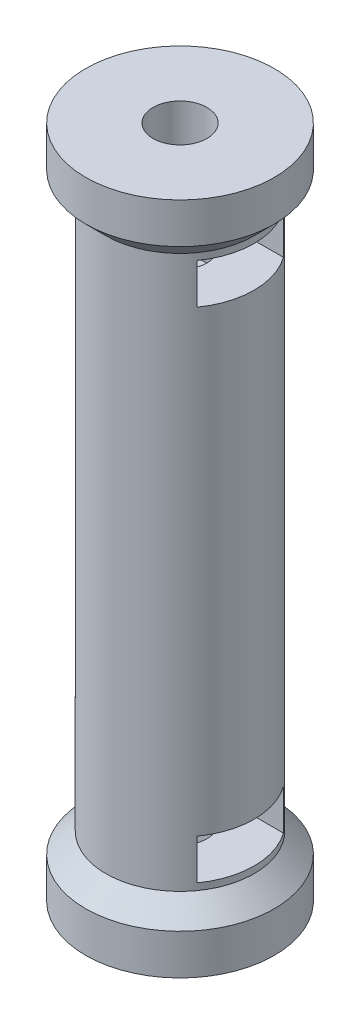
ISO-10303-21;
HEADER;
FILE_DESCRIPTION(('STEP AP214'),'2;1');
FILE_NAME('part.step','',(''),(''),'','','');
FILE_SCHEMA(('AUTOMOTIVE_DESIGN { 1 0 10303 214 1 1 1 1 }'));
ENDSEC;
DATA;
#1=APPLICATION_CONTEXT('core data for automotive mechanical design processes');
#2=APPLICATION_PROTOCOL_DEFINITION('international standard','automotive_design',2000,#1);
#3=PRODUCT_CONTEXT('',#1,'mechanical');
#4=PRODUCT('Part','Part','',(#3));
#5=PRODUCT_RELATED_PRODUCT_CATEGORY('part','',(#4));
#6=PRODUCT_DEFINITION_FORMATION('','',#4);
#7=PRODUCT_DEFINITION_CONTEXT('part definition',#1,'design');
#8=PRODUCT_DEFINITION('design','',#6,#7);
#9=PRODUCT_DEFINITION_SHAPE('','',#8);
#10=(LENGTH_UNIT() NAMED_UNIT(*) SI_UNIT(.MILLI.,.METRE.));
#11=(NAMED_UNIT(*) PLANE_ANGLE_UNIT() SI_UNIT($,.RADIAN.));
#12=(NAMED_UNIT(*) SI_UNIT($,.STERADIAN.) SOLID_ANGLE_UNIT());
#13=UNCERTAINTY_MEASURE_WITH_UNIT(LENGTH_MEASURE(1.E-05),#10,'distance_accuracy_value','');
#14=(GEOMETRIC_REPRESENTATION_CONTEXT(3) GLOBAL_UNCERTAINTY_ASSIGNED_CONTEXT((#13)) GLOBAL_UNIT_ASSIGNED_CONTEXT((#10,
#11,#12)) REPRESENTATION_CONTEXT('',''));
#15=CARTESIAN_POINT('',(0.,0.,0.));
#16=DIRECTION('',(0.,0.,1.));
#17=DIRECTION('',(1.,0.,0.));
#18=AXIS2_PLACEMENT_3D('',#15,#16,#17);
#19=CARTESIAN_POINT('',(0.,20.,0.));
#20=DIRECTION('',(0.,-1.,0.));
#21=DIRECTION('',(0.,0.,-1.));
#22=AXIS2_PLACEMENT_3D('',#19,#20,#21);
#23=CYLINDRICAL_SURFACE('',#22,5.5);
#24=CARTESIAN_POINT('',(0.,17.,0.));
#25=DIRECTION('',(0.,1.,0.));
#26=DIRECTION('',(0.,0.,1.));
#27=AXIS2_PLACEMENT_3D('',#24,#25,#26);
#28=CIRCLE('',#27,5.5);
#29=CARTESIAN_POINT('',(4.47325384926901,17.,3.2));
#30=VERTEX_POINT('',#29);
#31=CARTESIAN_POINT('',(4.47325384926901,17.,-3.2));
#32=VERTEX_POINT('',#31);
#33=EDGE_CURVE('E221',#30,#32,#28,.T.);
#34=ORIENTED_EDGE('',*,*,#33,.F.);
#35=DIRECTION('',(0.,-1.,0.));
#36=VECTOR('',#35,1.);
#37=CARTESIAN_POINT('',(4.47325384926901,20.,3.2));
#38=LINE('',#37,#36);
#39=CARTESIAN_POINT('',(4.47325384926901,20.,3.2));
#40=VERTEX_POINT('',#39);
#41=EDGE_CURVE('E239',#40,#30,#38,.T.);
#42=ORIENTED_EDGE('',*,*,#41,.F.);
#43=CARTESIAN_POINT('',(0.,20.,0.));
#44=DIRECTION('',(0.,1.,0.));
#45=DIRECTION('',(0.,0.,1.));
#46=AXIS2_PLACEMENT_3D('',#43,#44,#45);
#47=CIRCLE('',#46,5.5);
#48=CARTESIAN_POINT('',(4.47325384926901,20.,-3.2));
#49=VERTEX_POINT('',#48);
#50=EDGE_CURVE('E217',#40,#49,#47,.T.);
#51=ORIENTED_EDGE('',*,*,#50,.T.);
#52=DIRECTION('',(0.,-1.,0.));
#53=VECTOR('',#52,1.);
#54=CARTESIAN_POINT('',(4.47325384926901,20.,-3.2));
#55=LINE('',#54,#53);
#56=EDGE_CURVE('E245',#32,#49,#55,.F.);
#57=ORIENTED_EDGE('',*,*,#56,.F.);
#58=EDGE_LOOP('',(#34,#42,#51,#57));
#59=FACE_BOUND('',#58,.T.);
#60=CARTESIAN_POINT('',(0.,20.5,0.));
#61=DIRECTION('',(0.,1.,0.));
#62=DIRECTION('',(0.,0.,1.));
#63=AXIS2_PLACEMENT_3D('',#60,#61,#62);
#64=CIRCLE('',#63,5.5);
#65=CARTESIAN_POINT('',(0.,20.5,5.5));
#66=VERTEX_POINT('',#65);
#67=EDGE_CURVE('E236',#66,#66,#64,.F.);
#68=ORIENTED_EDGE('',*,*,#67,.T.);
#69=EDGE_LOOP('',(#68));
#70=FACE_BOUND('',#69,.T.);
#71=CARTESIAN_POINT('',(0.,-20.5,0.));
#72=DIRECTION('',(0.,-1.,0.));
#73=DIRECTION('',(0.,0.,-1.));
#74=AXIS2_PLACEMENT_3D('',#71,#72,#73);
#75=CIRCLE('',#74,5.5);
#76=CARTESIAN_POINT('',(0.,-20.5,-5.5));
#77=VERTEX_POINT('',#76);
#78=EDGE_CURVE('E153',#77,#77,#75,.F.);
#79=ORIENTED_EDGE('',*,*,#78,.T.);
#80=EDGE_LOOP('',(#79));
#81=FACE_BOUND('',#80,.T.);
#82=CARTESIAN_POINT('',(0.,-17.,0.));
#83=DIRECTION('',(0.,-1.,0.));
#84=DIRECTION('',(0.,0.,-1.));
#85=AXIS2_PLACEMENT_3D('',#82,#83,#84);
#86=CIRCLE('',#85,5.5);
#87=CARTESIAN_POINT('',(4.47325384926901,-17.,-3.2));
#88=VERTEX_POINT('',#87);
#89=CARTESIAN_POINT('',(4.47325384926901,-17.,3.2));
#90=VERTEX_POINT('',#89);
#91=EDGE_CURVE('E151',#88,#90,#86,.T.);
#92=ORIENTED_EDGE('',*,*,#91,.F.);
#93=DIRECTION('',(0.,-1.,0.));
#94=VECTOR('',#93,1.);
#95=CARTESIAN_POINT('',(4.47325384926901,20.,-3.2));
#96=LINE('',#95,#94);
#97=CARTESIAN_POINT('',(4.47325384926901,-20.,-3.2));
#98=VERTEX_POINT('',#97);
#99=EDGE_CURVE('E134',#88,#98,#96,.T.);
#100=ORIENTED_EDGE('',*,*,#99,.T.);
#101=CARTESIAN_POINT('',(0.,-20.,0.));
#102=DIRECTION('',(0.,-1.,0.));
#103=DIRECTION('',(0.,0.,-1.));
#104=AXIS2_PLACEMENT_3D('',#101,#102,#103);
#105=CIRCLE('',#104,5.5);
#106=CARTESIAN_POINT('',(4.47325384926901,-20.,3.2));
#107=VERTEX_POINT('',#106);
#108=EDGE_CURVE('E142',#98,#107,#105,.T.);
#109=ORIENTED_EDGE('',*,*,#108,.T.);
#110=DIRECTION('',(0.,-1.,0.));
#111=VECTOR('',#110,1.);
#112=CARTESIAN_POINT('',(4.47325384926901,20.,3.2));
#113=LINE('',#112,#111);
#114=EDGE_CURVE('E152',#107,#90,#113,.F.);
#115=ORIENTED_EDGE('',*,*,#114,.T.);
#116=EDGE_LOOP('',(#92,#100,#109,#115));
#117=FACE_BOUND('',#116,.T.);
#118=ADVANCED_FACE('F37',(#59,#70,#81,#117),#23,.T.);
#119=CARTESIAN_POINT('',(0.,25.,0.));
#120=DIRECTION('',(0.,-1.,0.));
#121=DIRECTION('',(0.,0.,-1.));
#122=AXIS2_PLACEMENT_3D('',#119,#120,#121);
#123=CYLINDRICAL_SURFACE('',#122,7.);
#124=CARTESIAN_POINT('',(0.,22.,0.));
#125=DIRECTION('',(0.,1.,0.));
#126=DIRECTION('',(0.,0.,1.));
#127=AXIS2_PLACEMENT_3D('',#124,#125,#126);
#128=CIRCLE('',#127,7.);
#129=CARTESIAN_POINT('',(0.,22.,7.));
#130=VERTEX_POINT('',#129);
#131=EDGE_CURVE('E233',#130,#130,#128,.T.);
#132=ORIENTED_EDGE('',*,*,#131,.T.);
#133=EDGE_LOOP('',(#132));
#134=FACE_BOUND('',#133,.T.);
#135=CARTESIAN_POINT('',(0.,25.,0.));
#136=DIRECTION('',(0.,1.,0.));
#137=DIRECTION('',(0.,0.,1.));
#138=AXIS2_PLACEMENT_3D('',#135,#136,#137);
#139=CIRCLE('',#138,7.);
#140=CARTESIAN_POINT('',(0.,25.,7.));
#141=VERTEX_POINT('',#140);
#142=EDGE_CURVE('E228',#141,#141,#139,.T.);
#143=ORIENTED_EDGE('',*,*,#142,.F.);
#144=EDGE_LOOP('',(#143));
#145=FACE_BOUND('',#144,.T.);
#146=ADVANCED_FACE('F279',(#134,#145),#123,.T.);
#147=CARTESIAN_POINT('',(0.,25.,0.));
#148=DIRECTION('',(0.,1.,0.));
#149=DIRECTION('',(0.,0.,1.));
#150=AXIS2_PLACEMENT_3D('',#147,#148,#149);
#151=PLANE('',#150);
#152=CARTESIAN_POINT('',(0.,25.,0.));
#153=DIRECTION('',(0.,1.,0.));
#154=DIRECTION('',(0.,0.,1.));
#155=AXIS2_PLACEMENT_3D('',#152,#153,#154);
#156=CIRCLE('',#155,2.);
#157=CARTESIAN_POINT('',(0.,25.,2.));
#158=VERTEX_POINT('',#157);
#159=EDGE_CURVE('E224',#158,#158,#156,.T.);
#160=ORIENTED_EDGE('',*,*,#159,.F.);
#161=EDGE_LOOP('',(#160));
#162=FACE_BOUND('',#161,.T.);
#163=ORIENTED_EDGE('',*,*,#142,.T.);
#164=EDGE_LOOP('',(#163));
#165=FACE_BOUND('',#164,.T.);
#166=ADVANCED_FACE('F285',(#162,#165),#151,.T.);
#167=CARTESIAN_POINT('',(0.,22.,0.));
#168=DIRECTION('',(0.,1.,0.));
#169=DIRECTION('',(0.,0.,1.));
#170=AXIS2_PLACEMENT_3D('',#167,#168,#169);
#171=CONICAL_SURFACE('',#170,7.,0.785398163397443);
#172=ORIENTED_EDGE('',*,*,#67,.F.);
#173=EDGE_LOOP('',(#172));
#174=FACE_BOUND('',#173,.T.);
#175=ORIENTED_EDGE('',*,*,#131,.F.);
#176=EDGE_LOOP('',(#175));
#177=FACE_BOUND('',#176,.T.);
#178=ADVANCED_FACE('F293',(#174,#177),#171,.T.);
#179=CARTESIAN_POINT('',(0.,15.,0.));
#180=DIRECTION('',(0.,1.,0.));
#181=DIRECTION('',(0.,0.,1.));
#182=AXIS2_PLACEMENT_3D('',#179,#180,#181);
#183=CYLINDRICAL_SURFACE('',#182,2.);
#184=CARTESIAN_POINT('',(0.,20.,0.));
#185=DIRECTION('',(0.,1.,0.));
#186=DIRECTION('',(0.,0.,1.));
#187=AXIS2_PLACEMENT_3D('',#184,#185,#186);
#188=CIRCLE('',#187,2.);
#189=CARTESIAN_POINT('',(0.,20.,2.));
#190=VERTEX_POINT('',#189);
#191=EDGE_CURVE('E210',#190,#190,#188,.F.);
#192=ORIENTED_EDGE('',*,*,#191,.T.);
#193=EDGE_LOOP('',(#192));
#194=FACE_BOUND('',#193,.T.);
#195=ORIENTED_EDGE('',*,*,#159,.T.);
#196=EDGE_LOOP('',(#195));
#197=FACE_BOUND('',#196,.T.);
#198=ADVANCED_FACE('F299',(#194,#197),#183,.F.);
#199=CARTESIAN_POINT('',(-3.5,17.,-3.2));
#200=DIRECTION('',(0.,0.,1.));
#201=DIRECTION('',(1.,0.,0.));
#202=AXIS2_PLACEMENT_3D('',#199,#200,#201);
#203=PLANE('',#202);
#204=DIRECTION('',(1.,0.,0.));
#205=VECTOR('',#204,1.);
#206=CARTESIAN_POINT('',(-3.5,20.,-3.2));
#207=LINE('',#206,#205);
#208=CARTESIAN_POINT('',(-2.49999999999999,20.,-3.2));
#209=VERTEX_POINT('',#208);
#210=EDGE_CURVE('E213',#209,#49,#207,.T.);
#211=ORIENTED_EDGE('',*,*,#210,.F.);
#212=DIRECTION('',(0.,-1.,0.));
#213=VECTOR('',#212,1.);
#214=CARTESIAN_POINT('',(-2.49999999999999,17.,-3.2));
#215=LINE('',#214,#213);
#216=CARTESIAN_POINT('',(-2.49999999999999,17.,-3.2));
#217=VERTEX_POINT('',#216);
#218=EDGE_CURVE('E264',#209,#217,#215,.T.);
#219=ORIENTED_EDGE('',*,*,#218,.T.);
#220=DIRECTION('',(1.,0.,0.));
#221=VECTOR('',#220,1.);
#222=CARTESIAN_POINT('',(-3.5,17.,-3.2));
#223=LINE('',#222,#221);
#224=EDGE_CURVE('E204',#217,#32,#223,.T.);
#225=ORIENTED_EDGE('',*,*,#224,.T.);
#226=ORIENTED_EDGE('',*,*,#56,.T.);
#227=EDGE_LOOP('',(#211,#219,#225,#226));
#228=FACE_BOUND('',#227,.T.);
#229=ADVANCED_FACE('F362',(#228),#203,.T.);
#230=CARTESIAN_POINT('',(-3.5,17.,3.2));
#231=DIRECTION('',(0.,0.,-1.));
#232=DIRECTION('',(-1.,0.,0.));
#233=AXIS2_PLACEMENT_3D('',#230,#231,#232);
#234=PLANE('',#233);
#235=DIRECTION('',(-1.,0.,0.));
#236=VECTOR('',#235,1.);
#237=CARTESIAN_POINT('',(-3.5,17.,3.2));
#238=LINE('',#237,#236);
#239=CARTESIAN_POINT('',(-2.49999999999999,17.,3.2));
#240=VERTEX_POINT('',#239);
#241=EDGE_CURVE('E207',#30,#240,#238,.T.);
#242=ORIENTED_EDGE('',*,*,#241,.T.);
#243=DIRECTION('',(0.,1.,0.));
#244=VECTOR('',#243,1.);
#245=CARTESIAN_POINT('',(-2.49999999999999,20.,3.2));
#246=LINE('',#245,#244);
#247=CARTESIAN_POINT('',(-2.49999999999999,20.,3.2));
#248=VERTEX_POINT('',#247);
#249=EDGE_CURVE('E248',#240,#248,#246,.T.);
#250=ORIENTED_EDGE('',*,*,#249,.T.);
#251=DIRECTION('',(-1.,0.,0.));
#252=VECTOR('',#251,1.);
#253=CARTESIAN_POINT('',(-3.5,20.,3.2));
#254=LINE('',#253,#252);
#255=EDGE_CURVE('E205',#40,#248,#254,.T.);
#256=ORIENTED_EDGE('',*,*,#255,.F.);
#257=ORIENTED_EDGE('',*,*,#41,.T.);
#258=EDGE_LOOP('',(#242,#250,#256,#257));
#259=FACE_BOUND('',#258,.T.);
#260=ADVANCED_FACE('F354',(#259),#234,.T.);
#261=CARTESIAN_POINT('',(0.,17.,0.));
#262=DIRECTION('',(0.,1.,0.));
#263=DIRECTION('',(0.,0.,1.));
#264=AXIS2_PLACEMENT_3D('',#261,#262,#263);
#265=PLANE('',#264);
#266=CARTESIAN_POINT('',(0.,17.,0.));
#267=DIRECTION('',(0.,1.,0.));
#268=DIRECTION('',(0.,0.,1.));
#269=AXIS2_PLACEMENT_3D('',#266,#267,#268);
#270=CIRCLE('',#269,2.);
#271=CARTESIAN_POINT('',(0.,17.,2.));
#272=VERTEX_POINT('',#271);
#273=EDGE_CURVE('E220',#272,#272,#270,.F.);
#274=ORIENTED_EDGE('',*,*,#273,.T.);
#275=EDGE_LOOP('',(#274));
#276=FACE_BOUND('',#275,.T.);
#277=DIRECTION('',(0.,0.,-1.));
#278=VECTOR('',#277,1.);
#279=CARTESIAN_POINT('',(-3.5,17.,-3.2));
#280=LINE('',#279,#278);
#281=CARTESIAN_POINT('',(-3.5,17.,2.19999999999999));
#282=VERTEX_POINT('',#281);
#283=CARTESIAN_POINT('',(-3.5,17.,-2.19999999999998));
#284=VERTEX_POINT('',#283);
#285=EDGE_CURVE('E201',#282,#284,#280,.T.);
#286=ORIENTED_EDGE('',*,*,#285,.F.);
#287=DIRECTION('',(-0.70710678118655,0.,-0.707106781186545));
#288=VECTOR('',#287,1.);
#289=CARTESIAN_POINT('',(-2.84999999999998,17.,2.85));
#290=LINE('',#289,#288);
#291=EDGE_CURVE('E262',#282,#240,#290,.F.);
#292=ORIENTED_EDGE('',*,*,#291,.T.);
#293=ORIENTED_EDGE('',*,*,#241,.F.);
#294=ORIENTED_EDGE('',*,*,#33,.T.);
#295=ORIENTED_EDGE('',*,*,#224,.F.);
#296=DIRECTION('',(0.707106781186543,0.,-0.707106781186552));
#297=VECTOR('',#296,1.);
#298=CARTESIAN_POINT('',(-2.85000000000001,17.,-2.84999999999997));
#299=LINE('',#298,#297);
#300=EDGE_CURVE('E260',#217,#284,#299,.F.);
#301=ORIENTED_EDGE('',*,*,#300,.T.);
#302=EDGE_LOOP('',(#286,#292,#293,#294,#295,#301));
#303=FACE_BOUND('',#302,.T.);
#304=ADVANCED_FACE('F350',(#276,#303),#265,.T.);
#305=CARTESIAN_POINT('',(0.,20.,0.));
#306=DIRECTION('',(0.,1.,0.));
#307=DIRECTION('',(0.,0.,1.));
#308=AXIS2_PLACEMENT_3D('',#305,#306,#307);
#309=PLANE('',#308);
#310=ORIENTED_EDGE('',*,*,#191,.F.);
#311=EDGE_LOOP('',(#310));
#312=FACE_BOUND('',#311,.T.);
#313=ORIENTED_EDGE('',*,*,#255,.T.);
#314=DIRECTION('',(0.70710678118655,0.,0.707106781186545));
#315=VECTOR('',#314,1.);
#316=CARTESIAN_POINT('',(-2.49999999999999,20.,3.2));
#317=LINE('',#316,#315);
#318=CARTESIAN_POINT('',(-3.5,20.,2.19999999999999));
#319=VERTEX_POINT('',#318);
#320=EDGE_CURVE('E253',#248,#319,#317,.F.);
#321=ORIENTED_EDGE('',*,*,#320,.T.);
#322=DIRECTION('',(0.,0.,-1.));
#323=VECTOR('',#322,1.);
#324=CARTESIAN_POINT('',(-3.5,20.,-3.2));
#325=LINE('',#324,#323);
#326=CARTESIAN_POINT('',(-3.5,20.,-2.19999999999998));
#327=VERTEX_POINT('',#326);
#328=EDGE_CURVE('E200',#319,#327,#325,.T.);
#329=ORIENTED_EDGE('',*,*,#328,.T.);
#330=DIRECTION('',(-0.707106781186543,0.,0.707106781186552));
#331=VECTOR('',#330,1.);
#332=CARTESIAN_POINT('',(-3.5,20.,-2.19999999999998));
#333=LINE('',#332,#331);
#334=EDGE_CURVE('E251',#327,#209,#333,.F.);
#335=ORIENTED_EDGE('',*,*,#334,.T.);
#336=ORIENTED_EDGE('',*,*,#210,.T.);
#337=ORIENTED_EDGE('',*,*,#50,.F.);
#338=EDGE_LOOP('',(#313,#321,#329,#335,#336,#337));
#339=FACE_BOUND('',#338,.T.);
#340=ADVANCED_FACE('F353',(#312,#339),#309,.F.);
#341=CARTESIAN_POINT('',(-3.5,17.,-3.2));
#342=DIRECTION('',(1.,0.,0.));
#343=DIRECTION('',(0.,0.,-1.));
#344=AXIS2_PLACEMENT_3D('',#341,#342,#343);
#345=PLANE('',#344);
#346=ORIENTED_EDGE('',*,*,#328,.F.);
#347=DIRECTION('',(0.,-1.,0.));
#348=VECTOR('',#347,1.);
#349=CARTESIAN_POINT('',(-3.5,17.,2.19999999999999));
#350=LINE('',#349,#348);
#351=EDGE_CURVE('E258',#319,#282,#350,.T.);
#352=ORIENTED_EDGE('',*,*,#351,.T.);
#353=ORIENTED_EDGE('',*,*,#285,.T.);
#354=DIRECTION('',(0.,1.,0.));
#355=VECTOR('',#354,1.);
#356=CARTESIAN_POINT('',(-3.5,20.,-2.19999999999998));
#357=LINE('',#356,#355);
#358=EDGE_CURVE('E255',#284,#327,#357,.T.);
#359=ORIENTED_EDGE('',*,*,#358,.T.);
#360=EDGE_LOOP('',(#346,#352,#353,#359));
#361=FACE_BOUND('',#360,.T.);
#362=ADVANCED_FACE('F358',(#361),#345,.T.);
#363=CARTESIAN_POINT('',(0.,15.,0.));
#364=DIRECTION('',(0.,1.,0.));
#365=DIRECTION('',(0.,0.,1.));
#366=AXIS2_PLACEMENT_3D('',#363,#364,#365);
#367=PLANE('',#366);
#368=CARTESIAN_POINT('',(0.,15.,0.));
#369=DIRECTION('',(0.,1.,0.));
#370=DIRECTION('',(0.,0.,1.));
#371=AXIS2_PLACEMENT_3D('',#368,#369,#370);
#372=CIRCLE('',#371,2.);
#373=CARTESIAN_POINT('',(0.,15.,2.));
#374=VERTEX_POINT('',#373);
#375=EDGE_CURVE('E225',#374,#374,#372,.T.);
#376=ORIENTED_EDGE('',*,*,#375,.T.);
#377=EDGE_LOOP('',(#376));
#378=FACE_BOUND('',#377,.T.);
#379=ADVANCED_FACE('F369',(#378),#367,.T.);
#380=ORIENTED_EDGE('',*,*,#375,.F.);
#381=EDGE_LOOP('',(#380));
#382=FACE_BOUND('',#381,.T.);
#383=ORIENTED_EDGE('',*,*,#273,.F.);
#384=EDGE_LOOP('',(#383));
#385=FACE_BOUND('',#384,.T.);
#386=ADVANCED_FACE('F308',(#382,#385),#183,.F.);
#387=CARTESIAN_POINT('',(-2.49999999999999,17.,3.2));
#388=DIRECTION('',(0.707106781186545,0.,-0.70710678118655));
#389=DIRECTION('',(0.,-1.,0.));
#390=AXIS2_PLACEMENT_3D('',#387,#388,#389);
#391=PLANE('',#390);
#392=ORIENTED_EDGE('',*,*,#291,.F.);
#393=ORIENTED_EDGE('',*,*,#351,.F.);
#394=ORIENTED_EDGE('',*,*,#320,.F.);
#395=ORIENTED_EDGE('',*,*,#249,.F.);
#396=EDGE_LOOP('',(#392,#393,#394,#395));
#397=FACE_BOUND('',#396,.T.);
#398=ADVANCED_FACE('F301',(#397),#391,.T.);
#399=CARTESIAN_POINT('',(-3.5,17.,-2.19999999999998));
#400=DIRECTION('',(0.707106781186552,0.,0.707106781186543));
#401=DIRECTION('',(0.,-1.,0.));
#402=AXIS2_PLACEMENT_3D('',#399,#400,#401);
#403=PLANE('',#402);
#404=ORIENTED_EDGE('',*,*,#300,.F.);
#405=ORIENTED_EDGE('',*,*,#218,.F.);
#406=ORIENTED_EDGE('',*,*,#334,.F.);
#407=ORIENTED_EDGE('',*,*,#358,.F.);
#408=EDGE_LOOP('',(#404,#405,#406,#407));
#409=FACE_BOUND('',#408,.T.);
#410=ADVANCED_FACE('F307',(#409),#403,.T.);
#411=CARTESIAN_POINT('',(0.,-25.,0.));
#412=DIRECTION('',(0.,1.,0.));
#413=DIRECTION('',(0.,0.,1.));
#414=AXIS2_PLACEMENT_3D('',#411,#412,#413);
#415=CYLINDRICAL_SURFACE('',#414,7.);
#416=CARTESIAN_POINT('',(0.,-22.,0.));
#417=DIRECTION('',(0.,-1.,0.));
#418=DIRECTION('',(0.,0.,-1.));
#419=AXIS2_PLACEMENT_3D('',#416,#417,#418);
#420=CIRCLE('',#419,7.);
#421=CARTESIAN_POINT('',(0.,-22.,-7.));
#422=VERTEX_POINT('',#421);
#423=EDGE_CURVE('E158',#422,#422,#420,.T.);
#424=ORIENTED_EDGE('',*,*,#423,.T.);
#425=EDGE_LOOP('',(#424));
#426=FACE_BOUND('',#425,.T.);
#427=CARTESIAN_POINT('',(0.,-25.,0.));
#428=DIRECTION('',(0.,1.,0.));
#429=DIRECTION('',(0.,0.,1.));
#430=AXIS2_PLACEMENT_3D('',#427,#428,#429);
#431=CIRCLE('',#430,7.);
#432=CARTESIAN_POINT('',(0.,-25.,7.));
#433=VERTEX_POINT('',#432);
#434=EDGE_CURVE('E195',#433,#433,#431,.T.);
#435=ORIENTED_EDGE('',*,*,#434,.T.);
#436=EDGE_LOOP('',(#435));
#437=FACE_BOUND('',#436,.T.);
#438=ADVANCED_FACE('F315',(#426,#437),#415,.T.);
#439=CARTESIAN_POINT('',(0.,-25.,0.));
#440=DIRECTION('',(0.,-1.,0.));
#441=DIRECTION('',(0.,0.,1.));
#442=AXIS2_PLACEMENT_3D('',#439,#440,#441);
#443=PLANE('',#442);
#444=CARTESIAN_POINT('',(0.,-25.,0.));
#445=DIRECTION('',(0.,1.,0.));
#446=DIRECTION('',(0.,0.,1.));
#447=AXIS2_PLACEMENT_3D('',#444,#445,#446);
#448=CIRCLE('',#447,2.);
#449=CARTESIAN_POINT('',(0.,-25.,2.));
#450=VERTEX_POINT('',#449);
#451=EDGE_CURVE('E191',#450,#450,#448,.T.);
#452=ORIENTED_EDGE('',*,*,#451,.T.);
#453=EDGE_LOOP('',(#452));
#454=FACE_BOUND('',#453,.T.);
#455=ORIENTED_EDGE('',*,*,#434,.F.);
#456=EDGE_LOOP('',(#455));
#457=FACE_BOUND('',#456,.T.);
#458=ADVANCED_FACE('F323',(#454,#457),#443,.T.);
#459=CARTESIAN_POINT('',(0.,-20.,0.));
#460=DIRECTION('',(0.,-1.,0.));
#461=DIRECTION('',(0.,0.,-1.));
#462=AXIS2_PLACEMENT_3D('',#459,#460,#461);
#463=CONICAL_SURFACE('',#462,4.99999999999996,0.785398163397453);
#464=ORIENTED_EDGE('',*,*,#423,.F.);
#465=EDGE_LOOP('',(#464));
#466=FACE_BOUND('',#465,.T.);
#467=ORIENTED_EDGE('',*,*,#78,.F.);
#468=EDGE_LOOP('',(#467));
#469=FACE_BOUND('',#468,.T.);
#470=ADVANCED_FACE('F317',(#466,#469),#463,.T.);
#471=CARTESIAN_POINT('',(0.,-15.,0.));
#472=DIRECTION('',(0.,-1.,0.));
#473=DIRECTION('',(0.,0.,-1.));
#474=AXIS2_PLACEMENT_3D('',#471,#472,#473);
#475=CYLINDRICAL_SURFACE('',#474,2.);
#476=CARTESIAN_POINT('',(0.,-20.,0.));
#477=DIRECTION('',(0.,-1.,0.));
#478=DIRECTION('',(0.,0.,-1.));
#479=AXIS2_PLACEMENT_3D('',#476,#477,#478);
#480=CIRCLE('',#479,2.);
#481=CARTESIAN_POINT('',(0.,-20.,-2.));
#482=VERTEX_POINT('',#481);
#483=EDGE_CURVE('E149',#482,#482,#480,.T.);
#484=ORIENTED_EDGE('',*,*,#483,.F.);
#485=EDGE_LOOP('',(#484));
#486=FACE_BOUND('',#485,.T.);
#487=ORIENTED_EDGE('',*,*,#451,.F.);
#488=EDGE_LOOP('',(#487));
#489=FACE_BOUND('',#488,.T.);
#490=ADVANCED_FACE('F322',(#486,#489),#475,.F.);
#491=CARTESIAN_POINT('',(-3.5,-17.,3.2));
#492=DIRECTION('',(0.,0.,1.));
#493=DIRECTION('',(1.,0.,0.));
#494=AXIS2_PLACEMENT_3D('',#491,#492,#493);
#495=PLANE('',#494);
#496=DIRECTION('',(-1.,0.,0.));
#497=VECTOR('',#496,1.);
#498=CARTESIAN_POINT('',(-3.5,-20.,3.2));
#499=LINE('',#498,#497);
#500=CARTESIAN_POINT('',(-2.49999999999999,-20.,3.2));
#501=VERTEX_POINT('',#500);
#502=EDGE_CURVE('E139',#107,#501,#499,.T.);
#503=ORIENTED_EDGE('',*,*,#502,.T.);
#504=DIRECTION('',(0.,1.,0.));
#505=VECTOR('',#504,1.);
#506=CARTESIAN_POINT('',(-2.49999999999999,-17.,3.2));
#507=LINE('',#506,#505);
#508=CARTESIAN_POINT('',(-2.49999999999999,-17.,3.2));
#509=VERTEX_POINT('',#508);
#510=EDGE_CURVE('E61',#501,#509,#507,.T.);
#511=ORIENTED_EDGE('',*,*,#510,.T.);
#512=DIRECTION('',(-1.,0.,0.));
#513=VECTOR('',#512,1.);
#514=CARTESIAN_POINT('',(-3.5,-17.,3.2));
#515=LINE('',#514,#513);
#516=EDGE_CURVE('E175',#90,#509,#515,.T.);
#517=ORIENTED_EDGE('',*,*,#516,.F.);
#518=ORIENTED_EDGE('',*,*,#114,.F.);
#519=EDGE_LOOP('',(#503,#511,#517,#518));
#520=FACE_BOUND('',#519,.T.);
#521=ADVANCED_FACE('F185',(#520),#495,.F.);
#522=CARTESIAN_POINT('',(-3.5,-17.,-3.2));
#523=DIRECTION('',(0.,0.,-1.));
#524=DIRECTION('',(-1.,0.,0.));
#525=AXIS2_PLACEMENT_3D('',#522,#523,#524);
#526=PLANE('',#525);
#527=DIRECTION('',(1.,0.,0.));
#528=VECTOR('',#527,1.);
#529=CARTESIAN_POINT('',(-3.5,-17.,-3.2));
#530=LINE('',#529,#528);
#531=CARTESIAN_POINT('',(-2.49999999999999,-17.,-3.2));
#532=VERTEX_POINT('',#531);
#533=EDGE_CURVE('E268',#532,#88,#530,.T.);
#534=ORIENTED_EDGE('',*,*,#533,.F.);
#535=DIRECTION('',(0.,-1.,0.));
#536=VECTOR('',#535,1.);
#537=CARTESIAN_POINT('',(-2.49999999999999,-20.,-3.2));
#538=LINE('',#537,#536);
#539=CARTESIAN_POINT('',(-2.49999999999999,-20.,-3.2));
#540=VERTEX_POINT('',#539);
#541=EDGE_CURVE('E11',#532,#540,#538,.T.);
#542=ORIENTED_EDGE('',*,*,#541,.T.);
#543=DIRECTION('',(1.,0.,0.));
#544=VECTOR('',#543,1.);
#545=CARTESIAN_POINT('',(-3.5,-20.,-3.2));
#546=LINE('',#545,#544);
#547=EDGE_CURVE('E130',#540,#98,#546,.T.);
#548=ORIENTED_EDGE('',*,*,#547,.T.);
#549=ORIENTED_EDGE('',*,*,#99,.F.);
#550=EDGE_LOOP('',(#534,#542,#548,#549));
#551=FACE_BOUND('',#550,.T.);
#552=ADVANCED_FACE('F132',(#551),#526,.F.);
#553=CARTESIAN_POINT('',(0.,-17.,0.));
#554=DIRECTION('',(0.,-1.,0.));
#555=DIRECTION('',(0.,0.,1.));
#556=AXIS2_PLACEMENT_3D('',#553,#554,#555);
#557=PLANE('',#556);
#558=CARTESIAN_POINT('',(0.,-17.,0.));
#559=DIRECTION('',(0.,-1.,0.));
#560=DIRECTION('',(0.,0.,-1.));
#561=AXIS2_PLACEMENT_3D('',#558,#559,#560);
#562=CIRCLE('',#561,2.);
#563=CARTESIAN_POINT('',(0.,-17.,-2.));
#564=VERTEX_POINT('',#563);
#565=EDGE_CURVE('E148',#564,#564,#562,.T.);
#566=ORIENTED_EDGE('',*,*,#565,.F.);
#567=EDGE_LOOP('',(#566));
#568=FACE_BOUND('',#567,.T.);
#569=ORIENTED_EDGE('',*,*,#516,.T.);
#570=DIRECTION('',(0.707106781186552,0.,0.707106781186543));
#571=VECTOR('',#570,1.);
#572=CARTESIAN_POINT('',(-2.84999999999997,-17.,2.85000000000001));
#573=LINE('',#572,#571);
#574=CARTESIAN_POINT('',(-3.5,-17.,2.2));
#575=VERTEX_POINT('',#574);
#576=EDGE_CURVE('E46',#509,#575,#573,.F.);
#577=ORIENTED_EDGE('',*,*,#576,.T.);
#578=DIRECTION('',(0.,0.,-1.));
#579=VECTOR('',#578,1.);
#580=CARTESIAN_POINT('',(-3.5,-17.,-3.2));
#581=LINE('',#580,#579);
#582=CARTESIAN_POINT('',(-3.5,-17.,-2.19999999999998));
#583=VERTEX_POINT('',#582);
#584=EDGE_CURVE('E138',#575,#583,#581,.T.);
#585=ORIENTED_EDGE('',*,*,#584,.T.);
#586=DIRECTION('',(-0.707106781186543,0.,0.707106781186552));
#587=VECTOR('',#586,1.);
#588=CARTESIAN_POINT('',(-2.85000000000001,-17.,-2.84999999999997));
#589=LINE('',#588,#587);
#590=EDGE_CURVE('E53',#583,#532,#589,.F.);
#591=ORIENTED_EDGE('',*,*,#590,.T.);
#592=ORIENTED_EDGE('',*,*,#533,.T.);
#593=ORIENTED_EDGE('',*,*,#91,.T.);
#594=EDGE_LOOP('',(#569,#577,#585,#591,#592,#593));
#595=FACE_BOUND('',#594,.T.);
#596=ADVANCED_FACE('F174',(#568,#595),#557,.T.);
#597=CARTESIAN_POINT('',(0.,-20.,0.));
#598=DIRECTION('',(0.,-1.,0.));
#599=DIRECTION('',(0.,0.,1.));
#600=AXIS2_PLACEMENT_3D('',#597,#598,#599);
#601=PLANE('',#600);
#602=ORIENTED_EDGE('',*,*,#483,.T.);
#603=EDGE_LOOP('',(#602));
#604=FACE_BOUND('',#603,.T.);
#605=DIRECTION('',(0.,0.,-1.));
#606=VECTOR('',#605,1.);
#607=CARTESIAN_POINT('',(-3.5,-20.,-3.2));
#608=LINE('',#607,#606);
#609=CARTESIAN_POINT('',(-3.5,-20.,2.2));
#610=VERTEX_POINT('',#609);
#611=CARTESIAN_POINT('',(-3.5,-20.,-2.19999999999998));
#612=VERTEX_POINT('',#611);
#613=EDGE_CURVE('E184',#610,#612,#608,.T.);
#614=ORIENTED_EDGE('',*,*,#613,.F.);
#615=DIRECTION('',(-0.707106781186552,0.,-0.707106781186543));
#616=VECTOR('',#615,1.);
#617=CARTESIAN_POINT('',(-3.5,-20.,2.2));
#618=LINE('',#617,#616);
#619=EDGE_CURVE('E169',#610,#501,#618,.F.);
#620=ORIENTED_EDGE('',*,*,#619,.T.);
#621=ORIENTED_EDGE('',*,*,#502,.F.);
#622=ORIENTED_EDGE('',*,*,#108,.F.);
#623=ORIENTED_EDGE('',*,*,#547,.F.);
#624=DIRECTION('',(0.707106781186543,0.,-0.707106781186552));
#625=VECTOR('',#624,1.);
#626=CARTESIAN_POINT('',(-2.49999999999999,-20.,-3.2));
#627=LINE('',#626,#625);
#628=EDGE_CURVE('E167',#540,#612,#627,.F.);
#629=ORIENTED_EDGE('',*,*,#628,.T.);
#630=EDGE_LOOP('',(#614,#620,#621,#622,#623,#629));
#631=FACE_BOUND('',#630,.T.);
#632=ADVANCED_FACE('F144',(#604,#631),#601,.F.);
#633=CARTESIAN_POINT('',(-3.5,-17.,-3.2));
#634=DIRECTION('',(-1.,0.,0.));
#635=DIRECTION('',(0.,0.,1.));
#636=AXIS2_PLACEMENT_3D('',#633,#634,#635);
#637=PLANE('',#636);
#638=ORIENTED_EDGE('',*,*,#584,.F.);
#639=DIRECTION('',(0.,-1.,0.));
#640=VECTOR('',#639,1.);
#641=CARTESIAN_POINT('',(-3.5,-20.,2.2));
#642=LINE('',#641,#640);
#643=EDGE_CURVE('E164',#575,#610,#642,.T.);
#644=ORIENTED_EDGE('',*,*,#643,.T.);
#645=ORIENTED_EDGE('',*,*,#613,.T.);
#646=DIRECTION('',(0.,1.,0.));
#647=VECTOR('',#646,1.);
#648=CARTESIAN_POINT('',(-3.5,-17.,-2.19999999999998));
#649=LINE('',#648,#647);
#650=EDGE_CURVE('E155',#612,#583,#649,.T.);
#651=ORIENTED_EDGE('',*,*,#650,.T.);
#652=EDGE_LOOP('',(#638,#644,#645,#651));
#653=FACE_BOUND('',#652,.T.);
#654=ADVANCED_FACE('F179',(#653),#637,.F.);
#655=CARTESIAN_POINT('',(0.,-15.,0.));
#656=DIRECTION('',(0.,-1.,0.));
#657=DIRECTION('',(0.,0.,1.));
#658=AXIS2_PLACEMENT_3D('',#655,#656,#657);
#659=PLANE('',#658);
#660=CARTESIAN_POINT('',(0.,-15.,0.));
#661=DIRECTION('',(0.,1.,0.));
#662=DIRECTION('',(0.,0.,1.));
#663=AXIS2_PLACEMENT_3D('',#660,#661,#662);
#664=CIRCLE('',#663,2.);
#665=CARTESIAN_POINT('',(0.,-15.,2.));
#666=VERTEX_POINT('',#665);
#667=EDGE_CURVE('E192',#666,#666,#664,.T.);
#668=ORIENTED_EDGE('',*,*,#667,.F.);
#669=EDGE_LOOP('',(#668));
#670=FACE_BOUND('',#669,.T.);
#671=ADVANCED_FACE('F501',(#670),#659,.T.);
#672=ORIENTED_EDGE('',*,*,#667,.T.);
#673=EDGE_LOOP('',(#672));
#674=FACE_BOUND('',#673,.T.);
#675=ORIENTED_EDGE('',*,*,#565,.T.);
#676=EDGE_LOOP('',(#675));
#677=FACE_BOUND('',#676,.T.);
#678=ADVANCED_FACE('F277',(#674,#677),#475,.F.);
#679=CARTESIAN_POINT('',(-3.5,-17.,2.2));
#680=DIRECTION('',(0.707106781186542,0.,-0.707106781186552));
#681=DIRECTION('',(0.,1.,0.));
#682=AXIS2_PLACEMENT_3D('',#679,#680,#681);
#683=PLANE('',#682);
#684=ORIENTED_EDGE('',*,*,#576,.F.);
#685=ORIENTED_EDGE('',*,*,#510,.F.);
#686=ORIENTED_EDGE('',*,*,#619,.F.);
#687=ORIENTED_EDGE('',*,*,#643,.F.);
#688=EDGE_LOOP('',(#684,#685,#686,#687));
#689=FACE_BOUND('',#688,.T.);
#690=ADVANCED_FACE('F183',(#689),#683,.T.);
#691=CARTESIAN_POINT('',(-2.49999999999999,-17.,-3.2));
#692=DIRECTION('',(0.707106781186552,0.,0.707106781186543));
#693=DIRECTION('',(0.,1.,0.));
#694=AXIS2_PLACEMENT_3D('',#691,#692,#693);
#695=PLANE('',#694);
#696=ORIENTED_EDGE('',*,*,#590,.F.);
#697=ORIENTED_EDGE('',*,*,#650,.F.);
#698=ORIENTED_EDGE('',*,*,#628,.F.);
#699=ORIENTED_EDGE('',*,*,#541,.F.);
#700=EDGE_LOOP('',(#696,#697,#698,#699));
#701=FACE_BOUND('',#700,.T.);
#702=ADVANCED_FACE('F40',(#701),#695,.T.);
#703=CLOSED_SHELL('',(#118,#146,#166,#178,#198,#229,#260,#304,#340,#362,#379,#386,#398,#410,
#438,#458,#470,#490,#521,#552,#596,#632,#654,#671,#678,#690,#702));
#704=MANIFOLD_SOLID_BREP('B2',#703);
#705=ADVANCED_BREP_SHAPE_REPRESENTATION('',(#18,#704),#14);
#706=SHAPE_DEFINITION_REPRESENTATION(#9,#705);
ENDSEC;
END-ISO-10303-21;
